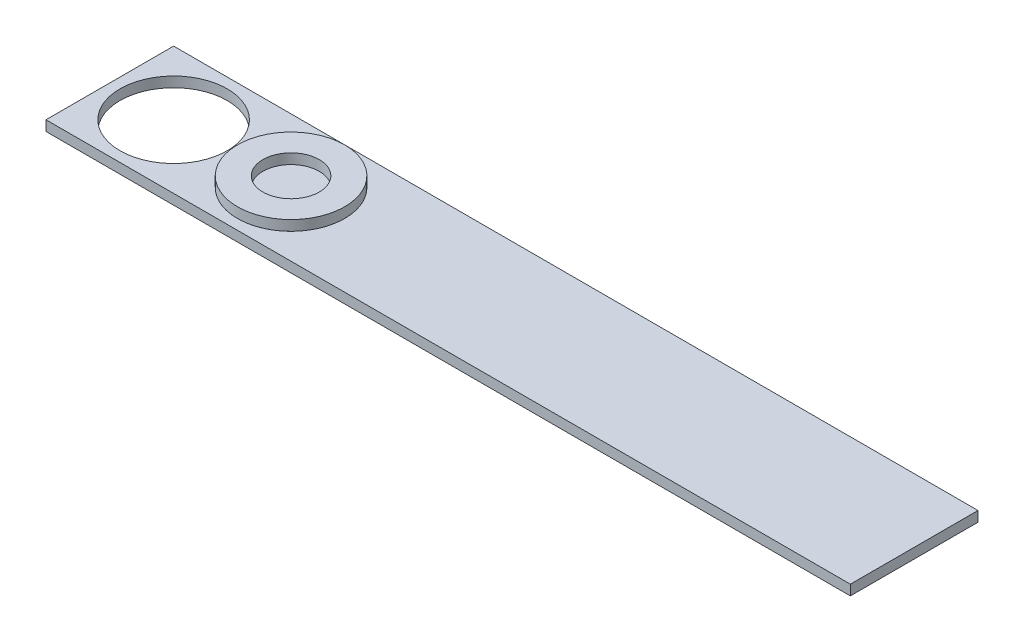
ISO-10303-21;
HEADER;
FILE_DESCRIPTION(('STEP AP214'),'2;1');
FILE_NAME('part.step','',(''),(''),'','','');
FILE_SCHEMA(('AUTOMOTIVE_DESIGN { 1 0 10303 214 1 1 1 1 }'));
ENDSEC;
DATA;
#1=APPLICATION_CONTEXT('core data for automotive mechanical design processes');
#2=APPLICATION_PROTOCOL_DEFINITION('international standard','automotive_design',2000,#1);
#3=PRODUCT_CONTEXT('',#1,'mechanical');
#4=PRODUCT('Part','Part','',(#3));
#5=PRODUCT_RELATED_PRODUCT_CATEGORY('part','',(#4));
#6=PRODUCT_DEFINITION_FORMATION('','',#4);
#7=PRODUCT_DEFINITION_CONTEXT('part definition',#1,'design');
#8=PRODUCT_DEFINITION('design','',#6,#7);
#9=PRODUCT_DEFINITION_SHAPE('','',#8);
#10=(LENGTH_UNIT() NAMED_UNIT(*) SI_UNIT(.MILLI.,.METRE.));
#11=(NAMED_UNIT(*) PLANE_ANGLE_UNIT() SI_UNIT($,.RADIAN.));
#12=(NAMED_UNIT(*) SI_UNIT($,.STERADIAN.) SOLID_ANGLE_UNIT());
#13=UNCERTAINTY_MEASURE_WITH_UNIT(LENGTH_MEASURE(1.E-05),#10,'distance_accuracy_value','');
#14=(GEOMETRIC_REPRESENTATION_CONTEXT(3) GLOBAL_UNCERTAINTY_ASSIGNED_CONTEXT((#13)) GLOBAL_UNIT_ASSIGNED_CONTEXT((#10,
#11,#12)) REPRESENTATION_CONTEXT('',''));
#15=CARTESIAN_POINT('',(0.,0.,0.));
#16=DIRECTION('',(0.,0.,1.));
#17=DIRECTION('',(1.,0.,0.));
#18=AXIS2_PLACEMENT_3D('',#15,#16,#17);
#19=CARTESIAN_POINT('',(-41.2,0.95,0.));
#20=DIRECTION('',(0.,-1.,0.));
#21=DIRECTION('',(0.,0.,-1.));
#22=AXIS2_PLACEMENT_3D('',#19,#20,#21);
#23=CYLINDRICAL_SURFACE('',#22,5.25);
#24=CARTESIAN_POINT('',(-41.2,0.95,0.));
#25=DIRECTION('',(0.,1.,0.));
#26=DIRECTION('',(0.,0.,1.));
#27=AXIS2_PLACEMENT_3D('',#24,#25,#26);
#28=CIRCLE('',#27,5.25);
#29=CARTESIAN_POINT('',(-41.2,0.95,-5.25));
#30=VERTEX_POINT('',#29);
#31=EDGE_CURVE('E11',#30,#30,#28,.T.);
#32=CARTESIAN_POINT('',(-41.2,-0.95,0.));
#33=DIRECTION('',(0.,1.,0.));
#34=DIRECTION('',(0.,0.,1.));
#35=AXIS2_PLACEMENT_3D('',#32,#33,#34);
#36=CIRCLE('',#35,5.25);
#37=CARTESIAN_POINT('',(-41.2,-0.95,-5.25));
#38=VERTEX_POINT('',#37);
#39=EDGE_CURVE('E51',#38,#38,#36,.T.);
#40=CARTESIAN_POINT('',(-41.2,0.95,-5.25));
#41=CARTESIAN_POINT('',(-41.2,0.930208333333333,-5.25));
#42=CARTESIAN_POINT('',(-41.2,0.910416666666667,-5.25));
#43=CARTESIAN_POINT('',(-41.2,0.870833333333333,-5.25));
#44=CARTESIAN_POINT('',(-41.2,0.851041666666667,-5.25));
#45=CARTESIAN_POINT('',(-41.2,0.811458333333333,-5.25));
#46=CARTESIAN_POINT('',(-41.2,0.791666666666667,-5.25));
#47=CARTESIAN_POINT('',(-41.2,0.752083333333333,-5.25));
#48=CARTESIAN_POINT('',(-41.2,0.732291666666667,-5.25));
#49=CARTESIAN_POINT('',(-41.2,0.692708333333333,-5.25));
#50=CARTESIAN_POINT('',(-41.2,0.672916666666667,-5.25));
#51=CARTESIAN_POINT('',(-41.2,0.633333333333333,-5.25));
#52=CARTESIAN_POINT('',(-41.2,0.613541666666667,-5.25));
#53=CARTESIAN_POINT('',(-41.2,0.573958333333333,-5.25));
#54=CARTESIAN_POINT('',(-41.2,0.554166666666667,-5.25));
#55=CARTESIAN_POINT('',(-41.2,0.514583333333333,-5.25));
#56=CARTESIAN_POINT('',(-41.2,0.494791666666667,-5.25));
#57=CARTESIAN_POINT('',(-41.2,0.455208333333333,-5.25));
#58=CARTESIAN_POINT('',(-41.2,0.435416666666667,-5.25));
#59=CARTESIAN_POINT('',(-41.2,0.395833333333333,-5.25));
#60=CARTESIAN_POINT('',(-41.2,0.376041666666667,-5.25));
#61=CARTESIAN_POINT('',(-41.2,0.336458333333333,-5.25));
#62=CARTESIAN_POINT('',(-41.2,0.316666666666667,-5.25));
#63=CARTESIAN_POINT('',(-41.2,0.277083333333333,-5.25));
#64=CARTESIAN_POINT('',(-41.2,0.257291666666667,-5.25));
#65=CARTESIAN_POINT('',(-41.2,0.217708333333333,-5.25));
#66=CARTESIAN_POINT('',(-41.2,0.197916666666667,-5.25));
#67=CARTESIAN_POINT('',(-41.2,0.158333333333333,-5.25));
#68=CARTESIAN_POINT('',(-41.2,0.138541666666667,-5.25));
#69=CARTESIAN_POINT('',(-41.2,0.0989583333333332,-5.25));
#70=CARTESIAN_POINT('',(-41.2,0.0791666666666666,-5.25));
#71=CARTESIAN_POINT('',(-41.2,0.0395833333333332,-5.25));
#72=CARTESIAN_POINT('',(-41.2,0.0197916666666665,-5.25));
#73=CARTESIAN_POINT('',(-41.2,-0.0197916666666667,-5.25));
#74=CARTESIAN_POINT('',(-41.2,-0.0395833333333333,-5.25));
#75=CARTESIAN_POINT('',(-41.2,-0.0791666666666665,-5.25));
#76=CARTESIAN_POINT('',(-41.2,-0.0989583333333332,-5.25));
#77=CARTESIAN_POINT('',(-41.2,-0.138541666666667,-5.25));
#78=CARTESIAN_POINT('',(-41.2,-0.158333333333333,-5.25));
#79=CARTESIAN_POINT('',(-41.2,-0.197916666666667,-5.25));
#80=CARTESIAN_POINT('',(-41.2,-0.217708333333333,-5.25));
#81=CARTESIAN_POINT('',(-41.2,-0.257291666666667,-5.25));
#82=CARTESIAN_POINT('',(-41.2,-0.277083333333333,-5.25));
#83=CARTESIAN_POINT('',(-41.2,-0.316666666666667,-5.25));
#84=CARTESIAN_POINT('',(-41.2,-0.336458333333333,-5.25));
#85=CARTESIAN_POINT('',(-41.2,-0.376041666666667,-5.25));
#86=CARTESIAN_POINT('',(-41.2,-0.395833333333333,-5.25));
#87=CARTESIAN_POINT('',(-41.2,-0.435416666666667,-5.25));
#88=CARTESIAN_POINT('',(-41.2,-0.455208333333333,-5.25));
#89=CARTESIAN_POINT('',(-41.2,-0.494791666666667,-5.25));
#90=CARTESIAN_POINT('',(-41.2,-0.514583333333333,-5.25));
#91=CARTESIAN_POINT('',(-41.2,-0.554166666666667,-5.25));
#92=CARTESIAN_POINT('',(-41.2,-0.573958333333333,-5.25));
#93=CARTESIAN_POINT('',(-41.2,-0.613541666666667,-5.25));
#94=CARTESIAN_POINT('',(-41.2,-0.633333333333333,-5.25));
#95=CARTESIAN_POINT('',(-41.2,-0.672916666666667,-5.25));
#96=CARTESIAN_POINT('',(-41.2,-0.692708333333333,-5.25));
#97=CARTESIAN_POINT('',(-41.2,-0.732291666666667,-5.25));
#98=CARTESIAN_POINT('',(-41.2,-0.752083333333333,-5.25));
#99=CARTESIAN_POINT('',(-41.2,-0.791666666666667,-5.25));
#100=CARTESIAN_POINT('',(-41.2,-0.811458333333333,-5.25));
#101=CARTESIAN_POINT('',(-41.2,-0.851041666666667,-5.25));
#102=CARTESIAN_POINT('',(-41.2,-0.870833333333333,-5.25));
#103=CARTESIAN_POINT('',(-41.2,-0.910416666666667,-5.25));
#104=CARTESIAN_POINT('',(-41.2,-0.930208333333333,-5.25));
#105=CARTESIAN_POINT('',(-41.2,-0.95,-5.25));
#106=B_SPLINE_CURVE_WITH_KNOTS('',3,(#40,#41,#42,#43,#44,#45,#46,#47,#48,#49,#50,#51,#52,#53,
#54,#55,#56,#57,#58,#59,#60,#61,#62,#63,#64,#65,#66,#67,#68,#69,#70,#71,#72,#73,#74,#75,#76,#77,
#78,#79,#80,#81,#82,#83,#84,#85,#86,#87,#88,#89,#90,#91,#92,#93,#94,#95,#96,#97,#98,#99,#100,
#101,#102,#103,#104,#105),.UNSPECIFIED.,.F.,.F.,(4,2,2,2,2,2,2,2,2,2,2,2,2,2,2,2,2,2,2,2,2,2,2,
2,2,2,2,2,2,2,2,2,4),(0.,0.059375,0.11875,0.178125,0.2375,0.296875,0.35625,0.415625,0.475,
0.534375,0.59375,0.653125,0.7125,0.771875,0.83125,0.890625,0.95,1.009375,1.06875,1.128125,
1.1875,1.246875,1.30625,1.365625,1.425,1.484375,1.54375,1.603125,1.6625,1.721875,1.78125,
1.840625,1.9),.UNSPECIFIED.);
#107=EDGE_CURVE('BSEAM48',#30,#38,#106,.T.);
#108=ORIENTED_EDGE('',*,*,#31,.F.);
#109=ORIENTED_EDGE('',*,*,#39,.T.);
#110=ORIENTED_EDGE('',*,*,#107,.T.);
#111=ORIENTED_EDGE('',*,*,#107,.F.);
#112=EDGE_LOOP('',(#108,#110,#109,#111));
#113=FACE_BOUND('',#112,.T.);
#114=ADVANCED_FACE('F48',(#113),#23,.T.);
#115=CARTESIAN_POINT('',(-41.2,0.95,0.));
#116=DIRECTION('',(0.,1.,0.));
#117=DIRECTION('',(0.,0.,1.));
#118=AXIS2_PLACEMENT_3D('',#115,#116,#117);
#119=PLANE('',#118);
#120=ORIENTED_EDGE('',*,*,#31,.T.);
#121=EDGE_LOOP('',(#120));
#122=FACE_BOUND('',#121,.T.);
#123=ADVANCED_FACE('F63',(#122),#119,.T.);
#124=CARTESIAN_POINT('',(-41.2,-0.95,0.));
#125=DIRECTION('',(0.,1.,0.));
#126=DIRECTION('',(0.,0.,1.));
#127=AXIS2_PLACEMENT_3D('',#124,#125,#126);
#128=PLANE('',#127);
#129=ORIENTED_EDGE('',*,*,#39,.F.);
#130=EDGE_LOOP('',(#129));
#131=FACE_BOUND('',#130,.T.);
#132=ADVANCED_FACE('F61',(#131),#128,.F.);
#133=CLOSED_SHELL('',(#114,#123,#132));
#134=MANIFOLD_SOLID_BREP('B2',#133);
#135=CARTESIAN_POINT('',(-41.2,2.85,0.));
#136=DIRECTION('',(0.,1.,0.));
#137=DIRECTION('',(0.,0.,1.));
#138=AXIS2_PLACEMENT_3D('',#135,#136,#137);
#139=PLANE('',#138);
#140=CARTESIAN_POINT('',(-41.2,2.85,0.));
#141=DIRECTION('',(0.,1.,0.));
#142=DIRECTION('',(0.,0.,1.));
#143=AXIS2_PLACEMENT_3D('',#140,#141,#142);
#144=CIRCLE('',#143,10.0000000000001);
#145=CARTESIAN_POINT('',(-41.2,2.85,-10.0000000000001));
#146=VERTEX_POINT('',#145);
#147=EDGE_CURVE('E47',#146,#146,#144,.T.);
#148=ORIENTED_EDGE('',*,*,#147,.T.);
#149=EDGE_LOOP('',(#148));
#150=FACE_BOUND('',#149,.T.);
#151=CARTESIAN_POINT('',(-41.2,2.85,0.));
#152=DIRECTION('',(0.,1.,0.));
#153=DIRECTION('',(0.,0.,1.));
#154=AXIS2_PLACEMENT_3D('',#151,#152,#153);
#155=CIRCLE('',#154,5.25);
#156=CARTESIAN_POINT('',(-41.2,2.85,-5.25));
#157=VERTEX_POINT('',#156);
#158=EDGE_CURVE('E109',#157,#157,#155,.T.);
#159=ORIENTED_EDGE('',*,*,#158,.F.);
#160=EDGE_LOOP('',(#159));
#161=FACE_BOUND('',#160,.T.);
#162=ADVANCED_FACE('F98',(#150,#161),#139,.T.);
#163=CARTESIAN_POINT('',(-41.2,0.95,0.));
#164=DIRECTION('',(0.,1.,0.));
#165=DIRECTION('',(0.,0.,1.));
#166=AXIS2_PLACEMENT_3D('',#163,#164,#165);
#167=PLANE('',#166);
#168=CARTESIAN_POINT('',(-41.2,0.95,0.));
#169=DIRECTION('',(0.,1.,0.));
#170=DIRECTION('',(0.,0.,1.));
#171=AXIS2_PLACEMENT_3D('',#168,#169,#170);
#172=CIRCLE('',#171,10.0000000000001);
#173=CARTESIAN_POINT('',(-41.2,0.95,-10.0000000000001));
#174=VERTEX_POINT('',#173);
#175=EDGE_CURVE('E102',#174,#174,#172,.T.);
#176=ORIENTED_EDGE('',*,*,#175,.F.);
#177=EDGE_LOOP('',(#176));
#178=FACE_BOUND('',#177,.T.);
#179=CARTESIAN_POINT('',(-41.2,0.95,0.));
#180=DIRECTION('',(0.,1.,0.));
#181=DIRECTION('',(0.,0.,1.));
#182=AXIS2_PLACEMENT_3D('',#179,#180,#181);
#183=CIRCLE('',#182,5.25);
#184=CARTESIAN_POINT('',(-41.2,0.95,-5.25));
#185=VERTEX_POINT('',#184);
#186=EDGE_CURVE('E111',#185,#185,#183,.T.);
#187=ORIENTED_EDGE('',*,*,#186,.T.);
#188=EDGE_LOOP('',(#187));
#189=FACE_BOUND('',#188,.T.);
#190=ADVANCED_FACE('F121',(#178,#189),#167,.F.);
#191=CARTESIAN_POINT('',(-41.2,2.85,0.));
#192=DIRECTION('',(0.,-1.,0.));
#193=DIRECTION('',(0.,0.,-1.));
#194=AXIS2_PLACEMENT_3D('',#191,#192,#193);
#195=CYLINDRICAL_SURFACE('',#194,10.0000000000001);
#196=CARTESIAN_POINT('',(-41.2,2.85,-10.0000000000001));
#197=CARTESIAN_POINT('',(-41.2,2.83020833333333,-10.0000000000001));
#198=CARTESIAN_POINT('',(-41.2,2.81041666666667,-10.0000000000001));
#199=CARTESIAN_POINT('',(-41.2,2.77083333333333,-10.0000000000001));
#200=CARTESIAN_POINT('',(-41.2,2.75104166666667,-10.0000000000001));
#201=CARTESIAN_POINT('',(-41.2,2.71145833333333,-10.0000000000001));
#202=CARTESIAN_POINT('',(-41.2,2.69166666666667,-10.0000000000001));
#203=CARTESIAN_POINT('',(-41.2,2.65208333333333,-10.0000000000001));
#204=CARTESIAN_POINT('',(-41.2,2.63229166666667,-10.0000000000001));
#205=CARTESIAN_POINT('',(-41.2,2.59270833333333,-10.0000000000001));
#206=CARTESIAN_POINT('',(-41.2,2.57291666666667,-10.0000000000001));
#207=CARTESIAN_POINT('',(-41.2,2.53333333333333,-10.0000000000001));
#208=CARTESIAN_POINT('',(-41.2,2.51354166666667,-10.0000000000001));
#209=CARTESIAN_POINT('',(-41.2,2.47395833333333,-10.0000000000001));
#210=CARTESIAN_POINT('',(-41.2,2.45416666666667,-10.0000000000001));
#211=CARTESIAN_POINT('',(-41.2,2.41458333333333,-10.0000000000001));
#212=CARTESIAN_POINT('',(-41.2,2.39479166666667,-10.0000000000001));
#213=CARTESIAN_POINT('',(-41.2,2.35520833333333,-10.0000000000001));
#214=CARTESIAN_POINT('',(-41.2,2.33541666666667,-10.0000000000001));
#215=CARTESIAN_POINT('',(-41.2,2.29583333333333,-10.0000000000001));
#216=CARTESIAN_POINT('',(-41.2,2.27604166666667,-10.0000000000001));
#217=CARTESIAN_POINT('',(-41.2,2.23645833333333,-10.0000000000001));
#218=CARTESIAN_POINT('',(-41.2,2.21666666666667,-10.0000000000001));
#219=CARTESIAN_POINT('',(-41.2,2.17708333333333,-10.0000000000001));
#220=CARTESIAN_POINT('',(-41.2,2.15729166666667,-10.0000000000001));
#221=CARTESIAN_POINT('',(-41.2,2.11770833333333,-10.0000000000001));
#222=CARTESIAN_POINT('',(-41.2,2.09791666666667,-10.0000000000001));
#223=CARTESIAN_POINT('',(-41.2,2.05833333333333,-10.0000000000001));
#224=CARTESIAN_POINT('',(-41.2,2.03854166666667,-10.0000000000001));
#225=CARTESIAN_POINT('',(-41.2,1.99895833333333,-10.0000000000001));
#226=CARTESIAN_POINT('',(-41.2,1.97916666666667,-10.0000000000001));
#227=CARTESIAN_POINT('',(-41.2,1.93958333333333,-10.0000000000001));
#228=CARTESIAN_POINT('',(-41.2,1.91979166666667,-10.0000000000001));
#229=CARTESIAN_POINT('',(-41.2,1.88020833333333,-10.0000000000001));
#230=CARTESIAN_POINT('',(-41.2,1.86041666666667,-10.0000000000001));
#231=CARTESIAN_POINT('',(-41.2,1.82083333333333,-10.0000000000001));
#232=CARTESIAN_POINT('',(-41.2,1.80104166666667,-10.0000000000001));
#233=CARTESIAN_POINT('',(-41.2,1.76145833333333,-10.0000000000001));
#234=CARTESIAN_POINT('',(-41.2,1.74166666666667,-10.0000000000001));
#235=CARTESIAN_POINT('',(-41.2,1.70208333333333,-10.0000000000001));
#236=CARTESIAN_POINT('',(-41.2,1.68229166666667,-10.0000000000001));
#237=CARTESIAN_POINT('',(-41.2,1.64270833333333,-10.0000000000001));
#238=CARTESIAN_POINT('',(-41.2,1.62291666666667,-10.0000000000001));
#239=CARTESIAN_POINT('',(-41.2,1.58333333333333,-10.0000000000001));
#240=CARTESIAN_POINT('',(-41.2,1.56354166666667,-10.0000000000001));
#241=CARTESIAN_POINT('',(-41.2,1.52395833333333,-10.0000000000001));
#242=CARTESIAN_POINT('',(-41.2,1.50416666666667,-10.0000000000001));
#243=CARTESIAN_POINT('',(-41.2,1.46458333333333,-10.0000000000001));
#244=CARTESIAN_POINT('',(-41.2,1.44479166666667,-10.0000000000001));
#245=CARTESIAN_POINT('',(-41.2,1.40520833333333,-10.0000000000001));
#246=CARTESIAN_POINT('',(-41.2,1.38541666666667,-10.0000000000001));
#247=CARTESIAN_POINT('',(-41.2,1.34583333333333,-10.0000000000001));
#248=CARTESIAN_POINT('',(-41.2,1.32604166666667,-10.0000000000001));
#249=CARTESIAN_POINT('',(-41.2,1.28645833333333,-10.0000000000001));
#250=CARTESIAN_POINT('',(-41.2,1.26666666666667,-10.0000000000001));
#251=CARTESIAN_POINT('',(-41.2,1.22708333333333,-10.0000000000001));
#252=CARTESIAN_POINT('',(-41.2,1.20729166666667,-10.0000000000001));
#253=CARTESIAN_POINT('',(-41.2,1.16770833333333,-10.0000000000001));
#254=CARTESIAN_POINT('',(-41.2,1.14791666666667,-10.0000000000001));
#255=CARTESIAN_POINT('',(-41.2,1.10833333333333,-10.0000000000001));
#256=CARTESIAN_POINT('',(-41.2,1.08854166666667,-10.0000000000001));
#257=CARTESIAN_POINT('',(-41.2,1.04895833333333,-10.0000000000001));
#258=CARTESIAN_POINT('',(-41.2,1.02916666666667,-10.0000000000001));
#259=CARTESIAN_POINT('',(-41.2,0.989583333333333,-10.0000000000001));
#260=CARTESIAN_POINT('',(-41.2,0.969791666666667,-10.0000000000001));
#261=CARTESIAN_POINT('',(-41.2,0.95,-10.0000000000001));
#262=B_SPLINE_CURVE_WITH_KNOTS('',3,(#196,#197,#198,#199,#200,#201,#202,#203,#204,#205,#206,
#207,#208,#209,#210,#211,#212,#213,#214,#215,#216,#217,#218,#219,#220,#221,#222,#223,#224,#225,
#226,#227,#228,#229,#230,#231,#232,#233,#234,#235,#236,#237,#238,#239,#240,#241,#242,#243,#244,
#245,#246,#247,#248,#249,#250,#251,#252,#253,#254,#255,#256,#257,#258,#259,#260,#261),
.UNSPECIFIED.,.F.,.F.,(4,2,2,2,2,2,2,2,2,2,2,2,2,2,2,2,2,2,2,2,2,2,2,2,2,2,2,2,2,2,2,2,4),(0.,
0.0593750000000004,0.11875,0.178125,0.2375,0.296875,0.35625,0.415625,0.475,0.534375,0.59375,
0.653125,0.7125,0.771875,0.83125,0.890625,0.95,1.009375,1.06875,1.128125,1.1875,1.246875,
1.30625,1.365625,1.425,1.484375,1.54375,1.603125,1.6625,1.721875,1.78125,1.840625,1.9),.UNSPECIFIED.);
#263=EDGE_CURVE('BSEAM100',#146,#174,#262,.T.);
#264=ORIENTED_EDGE('',*,*,#147,.F.);
#265=ORIENTED_EDGE('',*,*,#175,.T.);
#266=ORIENTED_EDGE('',*,*,#263,.T.);
#267=ORIENTED_EDGE('',*,*,#263,.F.);
#268=EDGE_LOOP('',(#264,#266,#265,#267));
#269=FACE_BOUND('',#268,.T.);
#270=ADVANCED_FACE('F100',(#269),#195,.T.);
#271=CARTESIAN_POINT('',(-41.2,2.85,0.));
#272=DIRECTION('',(0.,-1.,0.));
#273=DIRECTION('',(0.,0.,-1.));
#274=AXIS2_PLACEMENT_3D('',#271,#272,#273);
#275=CYLINDRICAL_SURFACE('',#274,5.25);
#276=CARTESIAN_POINT('',(-41.2,2.85,-5.25));
#277=CARTESIAN_POINT('',(-41.2,2.83020833333333,-5.25));
#278=CARTESIAN_POINT('',(-41.2,2.81041666666667,-5.25));
#279=CARTESIAN_POINT('',(-41.2,2.77083333333333,-5.25));
#280=CARTESIAN_POINT('',(-41.2,2.75104166666667,-5.25));
#281=CARTESIAN_POINT('',(-41.2,2.71145833333333,-5.25));
#282=CARTESIAN_POINT('',(-41.2,2.69166666666667,-5.25));
#283=CARTESIAN_POINT('',(-41.2,2.65208333333333,-5.25));
#284=CARTESIAN_POINT('',(-41.2,2.63229166666667,-5.25));
#285=CARTESIAN_POINT('',(-41.2,2.59270833333333,-5.25));
#286=CARTESIAN_POINT('',(-41.2,2.57291666666667,-5.25));
#287=CARTESIAN_POINT('',(-41.2,2.53333333333333,-5.25));
#288=CARTESIAN_POINT('',(-41.2,2.51354166666667,-5.25));
#289=CARTESIAN_POINT('',(-41.2,2.47395833333333,-5.25));
#290=CARTESIAN_POINT('',(-41.2,2.45416666666667,-5.25));
#291=CARTESIAN_POINT('',(-41.2,2.41458333333333,-5.25));
#292=CARTESIAN_POINT('',(-41.2,2.39479166666667,-5.25));
#293=CARTESIAN_POINT('',(-41.2,2.35520833333333,-5.25));
#294=CARTESIAN_POINT('',(-41.2,2.33541666666667,-5.25));
#295=CARTESIAN_POINT('',(-41.2,2.29583333333333,-5.25));
#296=CARTESIAN_POINT('',(-41.2,2.27604166666667,-5.25));
#297=CARTESIAN_POINT('',(-41.2,2.23645833333333,-5.25));
#298=CARTESIAN_POINT('',(-41.2,2.21666666666667,-5.25));
#299=CARTESIAN_POINT('',(-41.2,2.17708333333333,-5.25));
#300=CARTESIAN_POINT('',(-41.2,2.15729166666667,-5.25));
#301=CARTESIAN_POINT('',(-41.2,2.11770833333333,-5.25));
#302=CARTESIAN_POINT('',(-41.2,2.09791666666667,-5.25));
#303=CARTESIAN_POINT('',(-41.2,2.05833333333333,-5.25));
#304=CARTESIAN_POINT('',(-41.2,2.03854166666667,-5.25));
#305=CARTESIAN_POINT('',(-41.2,1.99895833333333,-5.25));
#306=CARTESIAN_POINT('',(-41.2,1.97916666666667,-5.25));
#307=CARTESIAN_POINT('',(-41.2,1.93958333333333,-5.25));
#308=CARTESIAN_POINT('',(-41.2,1.91979166666667,-5.25));
#309=CARTESIAN_POINT('',(-41.2,1.88020833333333,-5.25));
#310=CARTESIAN_POINT('',(-41.2,1.86041666666667,-5.25));
#311=CARTESIAN_POINT('',(-41.2,1.82083333333333,-5.25));
#312=CARTESIAN_POINT('',(-41.2,1.80104166666667,-5.25));
#313=CARTESIAN_POINT('',(-41.2,1.76145833333333,-5.25));
#314=CARTESIAN_POINT('',(-41.2,1.74166666666667,-5.25));
#315=CARTESIAN_POINT('',(-41.2,1.70208333333333,-5.25));
#316=CARTESIAN_POINT('',(-41.2,1.68229166666667,-5.25));
#317=CARTESIAN_POINT('',(-41.2,1.64270833333333,-5.25));
#318=CARTESIAN_POINT('',(-41.2,1.62291666666667,-5.25));
#319=CARTESIAN_POINT('',(-41.2,1.58333333333333,-5.25));
#320=CARTESIAN_POINT('',(-41.2,1.56354166666667,-5.25));
#321=CARTESIAN_POINT('',(-41.2,1.52395833333333,-5.25));
#322=CARTESIAN_POINT('',(-41.2,1.50416666666667,-5.25));
#323=CARTESIAN_POINT('',(-41.2,1.46458333333333,-5.25));
#324=CARTESIAN_POINT('',(-41.2,1.44479166666667,-5.25));
#325=CARTESIAN_POINT('',(-41.2,1.40520833333333,-5.25));
#326=CARTESIAN_POINT('',(-41.2,1.38541666666667,-5.25));
#327=CARTESIAN_POINT('',(-41.2,1.34583333333333,-5.25));
#328=CARTESIAN_POINT('',(-41.2,1.32604166666667,-5.25));
#329=CARTESIAN_POINT('',(-41.2,1.28645833333333,-5.25));
#330=CARTESIAN_POINT('',(-41.2,1.26666666666667,-5.25));
#331=CARTESIAN_POINT('',(-41.2,1.22708333333333,-5.25));
#332=CARTESIAN_POINT('',(-41.2,1.20729166666667,-5.25));
#333=CARTESIAN_POINT('',(-41.2,1.16770833333333,-5.25));
#334=CARTESIAN_POINT('',(-41.2,1.14791666666667,-5.25));
#335=CARTESIAN_POINT('',(-41.2,1.10833333333333,-5.25));
#336=CARTESIAN_POINT('',(-41.2,1.08854166666667,-5.25));
#337=CARTESIAN_POINT('',(-41.2,1.04895833333333,-5.25));
#338=CARTESIAN_POINT('',(-41.2,1.02916666666667,-5.25));
#339=CARTESIAN_POINT('',(-41.2,0.989583333333333,-5.25));
#340=CARTESIAN_POINT('',(-41.2,0.969791666666667,-5.25));
#341=CARTESIAN_POINT('',(-41.2,0.95,-5.25));
#342=B_SPLINE_CURVE_WITH_KNOTS('',3,(#276,#277,#278,#279,#280,#281,#282,#283,#284,#285,#286,
#287,#288,#289,#290,#291,#292,#293,#294,#295,#296,#297,#298,#299,#300,#301,#302,#303,#304,#305,
#306,#307,#308,#309,#310,#311,#312,#313,#314,#315,#316,#317,#318,#319,#320,#321,#322,#323,#324,
#325,#326,#327,#328,#329,#330,#331,#332,#333,#334,#335,#336,#337,#338,#339,#340,#341),
.UNSPECIFIED.,.F.,.F.,(4,2,2,2,2,2,2,2,2,2,2,2,2,2,2,2,2,2,2,2,2,2,2,2,2,2,2,2,2,2,2,2,4),(0.,
0.0593750000000004,0.11875,0.178125,0.2375,0.296875,0.35625,0.415625,0.475,0.534375,0.59375,
0.653125,0.7125,0.771875,0.83125,0.890625,0.95,1.009375,1.06875,1.128125,1.1875,1.246875,
1.30625,1.365625,1.425,1.484375,1.54375,1.603125,1.6625,1.721875,1.78125,1.840625,1.9),.UNSPECIFIED.);
#343=EDGE_CURVE('BSEAM117',#157,#185,#342,.T.);
#344=ORIENTED_EDGE('',*,*,#158,.T.);
#345=ORIENTED_EDGE('',*,*,#186,.F.);
#346=ORIENTED_EDGE('',*,*,#343,.T.);
#347=ORIENTED_EDGE('',*,*,#343,.F.);
#348=EDGE_LOOP('',(#344,#346,#345,#347));
#349=FACE_BOUND('',#348,.T.);
#350=ADVANCED_FACE('F117',(#349),#275,.F.);
#351=CLOSED_SHELL('',(#162,#190,#270,#350));
#352=MANIFOLD_SOLID_BREP('B6',#351);
#353=CARTESIAN_POINT('',(75.,0.95,11.9));
#354=DIRECTION('',(-1.,0.,0.));
#355=DIRECTION('',(0.,0.,1.));
#356=AXIS2_PLACEMENT_3D('',#353,#354,#355);
#357=PLANE('',#356);
#358=DIRECTION('',(0.,0.,-1.));
#359=VECTOR('',#358,1.);
#360=CARTESIAN_POINT('',(75.,-0.95,11.9));
#361=LINE('',#360,#359);
#362=CARTESIAN_POINT('',(75.,-0.95,11.9));
#363=VERTEX_POINT('',#362);
#364=CARTESIAN_POINT('',(75.,-0.95,-11.9));
#365=VERTEX_POINT('',#364);
#366=EDGE_CURVE('E223',#363,#365,#361,.T.);
#367=ORIENTED_EDGE('',*,*,#366,.T.);
#368=DIRECTION('',(0.,-1.,0.));
#369=VECTOR('',#368,1.);
#370=CARTESIAN_POINT('',(75.,0.95,-11.9));
#371=LINE('',#370,#369);
#372=CARTESIAN_POINT('',(75.,0.95,-11.9));
#373=VERTEX_POINT('',#372);
#374=EDGE_CURVE('E96',#373,#365,#371,.T.);
#375=ORIENTED_EDGE('',*,*,#374,.F.);
#376=DIRECTION('',(0.,0.,-1.));
#377=VECTOR('',#376,1.);
#378=CARTESIAN_POINT('',(75.,0.95,11.9));
#379=LINE('',#378,#377);
#380=CARTESIAN_POINT('',(75.,0.95,11.9));
#381=VERTEX_POINT('',#380);
#382=EDGE_CURVE('E211',#381,#373,#379,.T.);
#383=ORIENTED_EDGE('',*,*,#382,.F.);
#384=DIRECTION('',(0.,-1.,0.));
#385=VECTOR('',#384,1.);
#386=CARTESIAN_POINT('',(75.,0.95,11.9));
#387=LINE('',#386,#385);
#388=EDGE_CURVE('E219',#381,#363,#387,.T.);
#389=ORIENTED_EDGE('',*,*,#388,.T.);
#390=EDGE_LOOP('',(#367,#375,#383,#389));
#391=FACE_BOUND('',#390,.T.);
#392=ADVANCED_FACE('F160',(#391),#357,.F.);
#393=CARTESIAN_POINT('',(-75.,0.95,-11.9));
#394=DIRECTION('',(0.,0.,1.));
#395=DIRECTION('',(1.,0.,0.));
#396=AXIS2_PLACEMENT_3D('',#393,#394,#395);
#397=PLANE('',#396);
#398=DIRECTION('',(-1.,0.,0.));
#399=VECTOR('',#398,1.);
#400=CARTESIAN_POINT('',(-75.,-0.95,-11.9));
#401=LINE('',#400,#399);
#402=CARTESIAN_POINT('',(-75.,-0.95,-11.9));
#403=VERTEX_POINT('',#402);
#404=EDGE_CURVE('E215',#365,#403,#401,.T.);
#405=ORIENTED_EDGE('',*,*,#404,.T.);
#406=DIRECTION('',(0.,-1.,0.));
#407=VECTOR('',#406,1.);
#408=CARTESIAN_POINT('',(-75.,0.95,-11.9));
#409=LINE('',#408,#407);
#410=CARTESIAN_POINT('',(-75.,0.95,-11.9));
#411=VERTEX_POINT('',#410);
#412=EDGE_CURVE('E168',#411,#403,#409,.T.);
#413=ORIENTED_EDGE('',*,*,#412,.F.);
#414=DIRECTION('',(-1.,0.,0.));
#415=VECTOR('',#414,1.);
#416=CARTESIAN_POINT('',(-75.,0.95,-11.9));
#417=LINE('',#416,#415);
#418=EDGE_CURVE('E206',#373,#411,#417,.T.);
#419=ORIENTED_EDGE('',*,*,#418,.F.);
#420=ORIENTED_EDGE('',*,*,#374,.T.);
#421=EDGE_LOOP('',(#405,#413,#419,#420));
#422=FACE_BOUND('',#421,.T.);
#423=ADVANCED_FACE('F214',(#422),#397,.F.);
#424=CARTESIAN_POINT('',(-75.,0.95,11.9));
#425=DIRECTION('',(1.,0.,0.));
#426=DIRECTION('',(0.,0.,-1.));
#427=AXIS2_PLACEMENT_3D('',#424,#425,#426);
#428=PLANE('',#427);
#429=DIRECTION('',(0.,0.,1.));
#430=VECTOR('',#429,1.);
#431=CARTESIAN_POINT('',(-75.,-0.95,11.9));
#432=LINE('',#431,#430);
#433=CARTESIAN_POINT('',(-75.,-0.95,11.9));
#434=VERTEX_POINT('',#433);
#435=EDGE_CURVE('E193',#403,#434,#432,.T.);
#436=ORIENTED_EDGE('',*,*,#435,.T.);
#437=DIRECTION('',(0.,-1.,0.));
#438=VECTOR('',#437,1.);
#439=CARTESIAN_POINT('',(-75.,0.95,11.9));
#440=LINE('',#439,#438);
#441=CARTESIAN_POINT('',(-75.,0.95,11.9));
#442=VERTEX_POINT('',#441);
#443=EDGE_CURVE('E216',#442,#434,#440,.T.);
#444=ORIENTED_EDGE('',*,*,#443,.F.);
#445=DIRECTION('',(0.,0.,1.));
#446=VECTOR('',#445,1.);
#447=CARTESIAN_POINT('',(-75.,0.95,11.9));
#448=LINE('',#447,#446);
#449=EDGE_CURVE('E209',#411,#442,#448,.T.);
#450=ORIENTED_EDGE('',*,*,#449,.F.);
#451=ORIENTED_EDGE('',*,*,#412,.T.);
#452=EDGE_LOOP('',(#436,#444,#450,#451));
#453=FACE_BOUND('',#452,.T.);
#454=ADVANCED_FACE('F217',(#453),#428,.F.);
#455=CARTESIAN_POINT('',(-75.,0.95,11.9));
#456=DIRECTION('',(0.,0.,-1.));
#457=DIRECTION('',(-1.,0.,0.));
#458=AXIS2_PLACEMENT_3D('',#455,#456,#457);
#459=PLANE('',#458);
#460=DIRECTION('',(1.,0.,0.));
#461=VECTOR('',#460,1.);
#462=CARTESIAN_POINT('',(-75.,-0.95,11.9));
#463=LINE('',#462,#461);
#464=EDGE_CURVE('E199',#434,#363,#463,.T.);
#465=ORIENTED_EDGE('',*,*,#464,.T.);
#466=ORIENTED_EDGE('',*,*,#388,.F.);
#467=DIRECTION('',(1.,0.,0.));
#468=VECTOR('',#467,1.);
#469=CARTESIAN_POINT('',(-75.,0.95,11.9));
#470=LINE('',#469,#468);
#471=EDGE_CURVE('E176',#442,#381,#470,.T.);
#472=ORIENTED_EDGE('',*,*,#471,.F.);
#473=ORIENTED_EDGE('',*,*,#443,.T.);
#474=EDGE_LOOP('',(#465,#466,#472,#473));
#475=FACE_BOUND('',#474,.T.);
#476=ADVANCED_FACE('F231',(#475),#459,.F.);
#477=CARTESIAN_POINT('',(0.,0.95,0.));
#478=DIRECTION('',(0.,-1.,0.));
#479=DIRECTION('',(0.,0.,-1.));
#480=AXIS2_PLACEMENT_3D('',#477,#478,#479);
#481=PLANE('',#480);
#482=CARTESIAN_POINT('',(-41.2,0.95,0.));
#483=DIRECTION('',(0.,1.,0.));
#484=DIRECTION('',(0.,0.,1.));
#485=AXIS2_PLACEMENT_3D('',#482,#483,#484);
#486=CIRCLE('',#485,10.0000000000001);
#487=CARTESIAN_POINT('',(-41.2,0.95,10.0000000000001));
#488=VERTEX_POINT('',#487);
#489=EDGE_CURVE('E240',#488,#488,#486,.T.);
#490=ORIENTED_EDGE('',*,*,#489,.F.);
#491=EDGE_LOOP('',(#490));
#492=FACE_BOUND('',#491,.T.);
#493=CARTESIAN_POINT('',(-63.1,0.95,0.));
#494=DIRECTION('',(0.,1.,0.));
#495=DIRECTION('',(0.,0.,1.));
#496=AXIS2_PLACEMENT_3D('',#493,#494,#495);
#497=CIRCLE('',#496,10.);
#498=CARTESIAN_POINT('',(-63.1,0.95,10.));
#499=VERTEX_POINT('',#498);
#500=EDGE_CURVE('E226',#499,#499,#497,.T.);
#501=ORIENTED_EDGE('',*,*,#500,.F.);
#502=EDGE_LOOP('',(#501));
#503=FACE_BOUND('',#502,.T.);
#504=ORIENTED_EDGE('',*,*,#382,.T.);
#505=ORIENTED_EDGE('',*,*,#418,.T.);
#506=ORIENTED_EDGE('',*,*,#449,.T.);
#507=ORIENTED_EDGE('',*,*,#471,.T.);
#508=EDGE_LOOP('',(#504,#505,#506,#507));
#509=FACE_BOUND('',#508,.T.);
#510=ADVANCED_FACE('F207',(#492,#503,#509),#481,.F.);
#511=CARTESIAN_POINT('',(0.,-0.95,0.));
#512=DIRECTION('',(0.,-1.,0.));
#513=DIRECTION('',(0.,0.,-1.));
#514=AXIS2_PLACEMENT_3D('',#511,#512,#513);
#515=PLANE('',#514);
#516=CARTESIAN_POINT('',(-41.2,-0.95,0.));
#517=DIRECTION('',(0.,-1.,0.));
#518=DIRECTION('',(0.,0.,-1.));
#519=AXIS2_PLACEMENT_3D('',#516,#517,#518);
#520=CIRCLE('',#519,10.0000000000001);
#521=CARTESIAN_POINT('',(-41.2,-0.95,-10.0000000000001));
#522=VERTEX_POINT('',#521);
#523=EDGE_CURVE('E243',#522,#522,#520,.F.);
#524=ORIENTED_EDGE('',*,*,#523,.T.);
#525=EDGE_LOOP('',(#524));
#526=FACE_BOUND('',#525,.T.);
#527=CARTESIAN_POINT('',(-63.1,-0.95,0.));
#528=DIRECTION('',(0.,-1.,0.));
#529=DIRECTION('',(0.,0.,-1.));
#530=AXIS2_PLACEMENT_3D('',#527,#528,#529);
#531=CIRCLE('',#530,10.);
#532=CARTESIAN_POINT('',(-63.1,-0.95,-10.));
#533=VERTEX_POINT('',#532);
#534=EDGE_CURVE('E237',#533,#533,#531,.F.);
#535=ORIENTED_EDGE('',*,*,#534,.T.);
#536=EDGE_LOOP('',(#535));
#537=FACE_BOUND('',#536,.T.);
#538=ORIENTED_EDGE('',*,*,#366,.F.);
#539=ORIENTED_EDGE('',*,*,#464,.F.);
#540=ORIENTED_EDGE('',*,*,#435,.F.);
#541=ORIENTED_EDGE('',*,*,#404,.F.);
#542=EDGE_LOOP('',(#538,#539,#540,#541));
#543=FACE_BOUND('',#542,.T.);
#544=ADVANCED_FACE('F234',(#526,#537,#543),#515,.T.);
#545=CARTESIAN_POINT('',(-63.1,-0.951,0.));
#546=DIRECTION('',(0.,1.,0.));
#547=DIRECTION('',(0.,0.,1.));
#548=AXIS2_PLACEMENT_3D('',#545,#546,#547);
#549=CYLINDRICAL_SURFACE('',#548,10.);
#550=ORIENTED_EDGE('',*,*,#534,.F.);
#551=EDGE_LOOP('',(#550));
#552=FACE_BOUND('',#551,.T.);
#553=ORIENTED_EDGE('',*,*,#500,.T.);
#554=EDGE_LOOP('',(#553));
#555=FACE_BOUND('',#554,.T.);
#556=ADVANCED_FACE('F256',(#552,#555),#549,.F.);
#557=CARTESIAN_POINT('',(-41.2,-0.951,0.));
#558=DIRECTION('',(0.,1.,0.));
#559=DIRECTION('',(0.,0.,1.));
#560=AXIS2_PLACEMENT_3D('',#557,#558,#559);
#561=CYLINDRICAL_SURFACE('',#560,10.0000000000001);
#562=ORIENTED_EDGE('',*,*,#523,.F.);
#563=EDGE_LOOP('',(#562));
#564=FACE_BOUND('',#563,.T.);
#565=ORIENTED_EDGE('',*,*,#489,.T.);
#566=EDGE_LOOP('',(#565));
#567=FACE_BOUND('',#566,.T.);
#568=ADVANCED_FACE('F249',(#564,#567),#561,.F.);
#569=CLOSED_SHELL('',(#392,#423,#454,#476,#510,#544,#556,#568));
#570=MANIFOLD_SOLID_BREP('B42',#569);
#571=ADVANCED_BREP_SHAPE_REPRESENTATION('',(#18,#134,#352,#570),#14);
#572=SHAPE_DEFINITION_REPRESENTATION(#9,#571);
ENDSEC;
END-ISO-10303-21;
